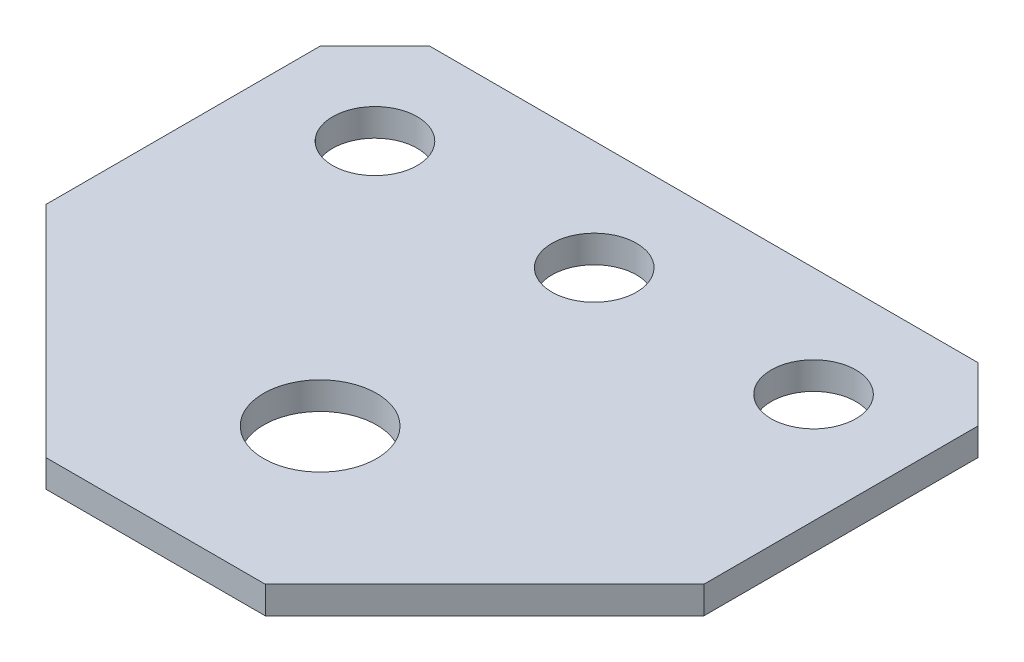
ISO-10303-21;
HEADER;
FILE_DESCRIPTION(('STEP AP214'),'2;1');
FILE_NAME('part.step','',(''),(''),'','','');
FILE_SCHEMA(('AUTOMOTIVE_DESIGN { 1 0 10303 214 1 1 1 1 }'));
ENDSEC;
DATA;
#1=APPLICATION_CONTEXT('core data for automotive mechanical design processes');
#2=APPLICATION_PROTOCOL_DEFINITION('international standard','automotive_design',2000,#1);
#3=PRODUCT_CONTEXT('',#1,'mechanical');
#4=PRODUCT('Part','Part','',(#3));
#5=PRODUCT_RELATED_PRODUCT_CATEGORY('part','',(#4));
#6=PRODUCT_DEFINITION_FORMATION('','',#4);
#7=PRODUCT_DEFINITION_CONTEXT('part definition',#1,'design');
#8=PRODUCT_DEFINITION('design','',#6,#7);
#9=PRODUCT_DEFINITION_SHAPE('','',#8);
#10=(LENGTH_UNIT() NAMED_UNIT(*) SI_UNIT(.MILLI.,.METRE.));
#11=(NAMED_UNIT(*) PLANE_ANGLE_UNIT() SI_UNIT($,.RADIAN.));
#12=(NAMED_UNIT(*) SI_UNIT($,.STERADIAN.) SOLID_ANGLE_UNIT());
#13=UNCERTAINTY_MEASURE_WITH_UNIT(LENGTH_MEASURE(1.E-05),#10,'distance_accuracy_value','');
#14=(GEOMETRIC_REPRESENTATION_CONTEXT(3) GLOBAL_UNCERTAINTY_ASSIGNED_CONTEXT((#13)) GLOBAL_UNIT_ASSIGNED_CONTEXT((#10,
#11,#12)) REPRESENTATION_CONTEXT('',''));
#15=CARTESIAN_POINT('',(0.,0.,0.));
#16=DIRECTION('',(0.,0.,1.));
#17=DIRECTION('',(1.,0.,0.));
#18=AXIS2_PLACEMENT_3D('',#15,#16,#17);
#19=CARTESIAN_POINT('',(38.1,1.5875,-31.75));
#20=DIRECTION('',(-1.,0.,0.));
#21=DIRECTION('',(0.,0.,1.));
#22=AXIS2_PLACEMENT_3D('',#19,#20,#21);
#23=PLANE('',#22);
#24=DIRECTION('',(0.,0.,-1.));
#25=VECTOR('',#24,1.);
#26=CARTESIAN_POINT('',(38.1,-1.5875,-31.75));
#27=LINE('',#26,#25);
#28=CARTESIAN_POINT('',(38.1,-1.5875,6.35000000000001));
#29=VERTEX_POINT('',#28);
#30=CARTESIAN_POINT('',(38.1,-1.5875,-25.4));
#31=VERTEX_POINT('',#30);
#32=EDGE_CURVE('E170',#29,#31,#27,.T.);
#33=ORIENTED_EDGE('',*,*,#32,.T.);
#34=DIRECTION('',(0.,1.,0.));
#35=VECTOR('',#34,1.);
#36=CARTESIAN_POINT('',(38.1,1.5875,-25.4));
#37=LINE('',#36,#35);
#38=CARTESIAN_POINT('',(38.1,1.5875,-25.4));
#39=VERTEX_POINT('',#38);
#40=EDGE_CURVE('E11',#31,#39,#37,.T.);
#41=ORIENTED_EDGE('',*,*,#40,.T.);
#42=DIRECTION('',(0.,0.,-1.));
#43=VECTOR('',#42,1.);
#44=CARTESIAN_POINT('',(38.1,1.5875,-31.75));
#45=LINE('',#44,#43);
#46=CARTESIAN_POINT('',(38.1,1.5875,6.35000000000001));
#47=VERTEX_POINT('',#46);
#48=EDGE_CURVE('E125',#47,#39,#45,.T.);
#49=ORIENTED_EDGE('',*,*,#48,.F.);
#50=DIRECTION('',(0.,-1.,0.));
#51=VECTOR('',#50,1.);
#52=CARTESIAN_POINT('',(38.1,1.5875,6.35000000000001));
#53=LINE('',#52,#51);
#54=EDGE_CURVE('E141',#47,#29,#53,.T.);
#55=ORIENTED_EDGE('',*,*,#54,.T.);
#56=EDGE_LOOP('',(#33,#41,#49,#55));
#57=FACE_BOUND('',#56,.T.);
#58=ADVANCED_FACE('F33',(#57),#23,.F.);
#59=CARTESIAN_POINT('',(-38.1,1.5875,-31.75));
#60=DIRECTION('',(0.,0.,1.));
#61=DIRECTION('',(1.,0.,0.));
#62=AXIS2_PLACEMENT_3D('',#59,#60,#61);
#63=PLANE('',#62);
#64=DIRECTION('',(-1.,0.,0.));
#65=VECTOR('',#64,1.);
#66=CARTESIAN_POINT('',(-38.1,-1.5875,-31.75));
#67=LINE('',#66,#65);
#68=CARTESIAN_POINT('',(31.75,-1.5875,-31.75));
#69=VERTEX_POINT('',#68);
#70=CARTESIAN_POINT('',(-31.75,-1.5875,-31.75));
#71=VERTEX_POINT('',#70);
#72=EDGE_CURVE('E130',#69,#71,#67,.T.);
#73=ORIENTED_EDGE('',*,*,#72,.T.);
#74=DIRECTION('',(0.,1.,0.));
#75=VECTOR('',#74,1.);
#76=CARTESIAN_POINT('',(-31.75,1.5875,-31.75));
#77=LINE('',#76,#75);
#78=CARTESIAN_POINT('',(-31.75,1.5875,-31.75));
#79=VERTEX_POINT('',#78);
#80=EDGE_CURVE('E54',#71,#79,#77,.T.);
#81=ORIENTED_EDGE('',*,*,#80,.T.);
#82=DIRECTION('',(-1.,0.,0.));
#83=VECTOR('',#82,1.);
#84=CARTESIAN_POINT('',(-38.1,1.5875,-31.75));
#85=LINE('',#84,#83);
#86=CARTESIAN_POINT('',(31.75,1.5875,-31.75));
#87=VERTEX_POINT('',#86);
#88=EDGE_CURVE('E128',#87,#79,#85,.T.);
#89=ORIENTED_EDGE('',*,*,#88,.F.);
#90=DIRECTION('',(0.,-1.,0.));
#91=VECTOR('',#90,1.);
#92=CARTESIAN_POINT('',(31.75,1.5875,-31.75));
#93=LINE('',#92,#91);
#94=EDGE_CURVE('E151',#87,#69,#93,.T.);
#95=ORIENTED_EDGE('',*,*,#94,.T.);
#96=EDGE_LOOP('',(#73,#81,#89,#95));
#97=FACE_BOUND('',#96,.T.);
#98=ADVANCED_FACE('F168',(#97),#63,.F.);
#99=CARTESIAN_POINT('',(-38.1,1.5875,-31.75));
#100=DIRECTION('',(1.,0.,0.));
#101=DIRECTION('',(0.,0.,-1.));
#102=AXIS2_PLACEMENT_3D('',#99,#100,#101);
#103=PLANE('',#102);
#104=DIRECTION('',(0.,0.,1.));
#105=VECTOR('',#104,1.);
#106=CARTESIAN_POINT('',(-38.1,1.5875,-31.75));
#107=LINE('',#106,#105);
#108=CARTESIAN_POINT('',(-38.1,1.5875,-25.4));
#109=VERTEX_POINT('',#108);
#110=CARTESIAN_POINT('',(-38.1,1.5875,6.34999999999989));
#111=VERTEX_POINT('',#110);
#112=EDGE_CURVE('E160',#109,#111,#107,.T.);
#113=ORIENTED_EDGE('',*,*,#112,.F.);
#114=DIRECTION('',(0.,-1.,0.));
#115=VECTOR('',#114,1.);
#116=CARTESIAN_POINT('',(-38.1,1.5875,-25.4));
#117=LINE('',#116,#115);
#118=CARTESIAN_POINT('',(-38.1,-1.5875,-25.4));
#119=VERTEX_POINT('',#118);
#120=EDGE_CURVE('E144',#109,#119,#117,.T.);
#121=ORIENTED_EDGE('',*,*,#120,.T.);
#122=DIRECTION('',(0.,0.,1.));
#123=VECTOR('',#122,1.);
#124=CARTESIAN_POINT('',(-38.1,-1.5875,-31.75));
#125=LINE('',#124,#123);
#126=CARTESIAN_POINT('',(-38.1,-1.5875,6.34999999999989));
#127=VERTEX_POINT('',#126);
#128=EDGE_CURVE('E126',#119,#127,#125,.T.);
#129=ORIENTED_EDGE('',*,*,#128,.T.);
#130=DIRECTION('',(0.,1.,0.));
#131=VECTOR('',#130,1.);
#132=CARTESIAN_POINT('',(-38.1,1.5875,6.34999999999989));
#133=LINE('',#132,#131);
#134=EDGE_CURVE('E107',#127,#111,#133,.T.);
#135=ORIENTED_EDGE('',*,*,#134,.T.);
#136=EDGE_LOOP('',(#113,#121,#129,#135));
#137=FACE_BOUND('',#136,.T.);
#138=ADVANCED_FACE('F164',(#137),#103,.F.);
#139=CARTESIAN_POINT('',(-38.1,1.5875,31.75));
#140=DIRECTION('',(0.,0.,-1.));
#141=DIRECTION('',(-1.,0.,0.));
#142=AXIS2_PLACEMENT_3D('',#139,#140,#141);
#143=PLANE('',#142);
#144=DIRECTION('',(1.,0.,0.));
#145=VECTOR('',#144,1.);
#146=CARTESIAN_POINT('',(-38.1,1.5875,31.75));
#147=LINE('',#146,#145);
#148=CARTESIAN_POINT('',(-12.7,1.5875,31.75));
#149=VERTEX_POINT('',#148);
#150=CARTESIAN_POINT('',(12.6999999999999,1.5875,31.75));
#151=VERTEX_POINT('',#150);
#152=EDGE_CURVE('E120',#149,#151,#147,.T.);
#153=ORIENTED_EDGE('',*,*,#152,.F.);
#154=DIRECTION('',(0.,-1.,0.));
#155=VECTOR('',#154,1.);
#156=CARTESIAN_POINT('',(-12.7,1.5875,31.75));
#157=LINE('',#156,#155);
#158=CARTESIAN_POINT('',(-12.7,-1.5875,31.75));
#159=VERTEX_POINT('',#158);
#160=EDGE_CURVE('E105',#149,#159,#157,.T.);
#161=ORIENTED_EDGE('',*,*,#160,.T.);
#162=DIRECTION('',(1.,0.,0.));
#163=VECTOR('',#162,1.);
#164=CARTESIAN_POINT('',(-38.1,-1.5875,31.75));
#165=LINE('',#164,#163);
#166=CARTESIAN_POINT('',(12.6999999999999,-1.5875,31.75));
#167=VERTEX_POINT('',#166);
#168=EDGE_CURVE('E117',#159,#167,#165,.T.);
#169=ORIENTED_EDGE('',*,*,#168,.T.);
#170=DIRECTION('',(0.,1.,0.));
#171=VECTOR('',#170,1.);
#172=CARTESIAN_POINT('',(12.6999999999999,1.5875,31.75));
#173=LINE('',#172,#171);
#174=EDGE_CURVE('E121',#167,#151,#173,.T.);
#175=ORIENTED_EDGE('',*,*,#174,.T.);
#176=EDGE_LOOP('',(#153,#161,#169,#175));
#177=FACE_BOUND('',#176,.T.);
#178=ADVANCED_FACE('F116',(#177),#143,.F.);
#179=CARTESIAN_POINT('',(0.,1.5875,0.));
#180=DIRECTION('',(0.,1.,0.));
#181=DIRECTION('',(0.,0.,1.));
#182=AXIS2_PLACEMENT_3D('',#179,#180,#181);
#183=PLANE('',#182);
#184=CARTESIAN_POINT('',(0.,1.5875,12.7));
#185=DIRECTION('',(0.,1.,0.));
#186=DIRECTION('',(0.,0.,1.));
#187=AXIS2_PLACEMENT_3D('',#184,#185,#186);
#188=CIRCLE('',#187,6.54811999999995);
#189=CARTESIAN_POINT('',(0.,1.5875,19.24812));
#190=VERTEX_POINT('',#189);
#191=EDGE_CURVE('E196',#190,#190,#188,.T.);
#192=ORIENTED_EDGE('',*,*,#191,.F.);
#193=EDGE_LOOP('',(#192));
#194=FACE_BOUND('',#193,.T.);
#195=CARTESIAN_POINT('',(0.,1.5875,-19.05));
#196=DIRECTION('',(0.,1.,0.));
#197=DIRECTION('',(0.,0.,1.));
#198=AXIS2_PLACEMENT_3D('',#195,#196,#197);
#199=CIRCLE('',#198,4.9022);
#200=CARTESIAN_POINT('',(0.,1.5875,-14.1478));
#201=VERTEX_POINT('',#200);
#202=EDGE_CURVE('E190',#201,#201,#199,.T.);
#203=ORIENTED_EDGE('',*,*,#202,.F.);
#204=EDGE_LOOP('',(#203));
#205=FACE_BOUND('',#204,.T.);
#206=CARTESIAN_POINT('',(25.4,1.5875,-19.05));
#207=DIRECTION('',(0.,1.,0.));
#208=DIRECTION('',(0.,0.,1.));
#209=AXIS2_PLACEMENT_3D('',#206,#207,#208);
#210=CIRCLE('',#209,4.9022);
#211=CARTESIAN_POINT('',(25.4,1.5875,-14.1478));
#212=VERTEX_POINT('',#211);
#213=EDGE_CURVE('E184',#212,#212,#210,.T.);
#214=ORIENTED_EDGE('',*,*,#213,.F.);
#215=EDGE_LOOP('',(#214));
#216=FACE_BOUND('',#215,.T.);
#217=CARTESIAN_POINT('',(-25.4,1.5875,-19.05));
#218=DIRECTION('',(0.,1.,0.));
#219=DIRECTION('',(0.,0.,1.));
#220=AXIS2_PLACEMENT_3D('',#217,#218,#219);
#221=CIRCLE('',#220,4.9022);
#222=CARTESIAN_POINT('',(-25.4,1.5875,-14.1478));
#223=VERTEX_POINT('',#222);
#224=EDGE_CURVE('E178',#223,#223,#221,.T.);
#225=ORIENTED_EDGE('',*,*,#224,.F.);
#226=EDGE_LOOP('',(#225));
#227=FACE_BOUND('',#226,.T.);
#228=ORIENTED_EDGE('',*,*,#88,.T.);
#229=DIRECTION('',(0.707106781186548,0.,-0.707106781186547));
#230=VECTOR('',#229,1.);
#231=CARTESIAN_POINT('',(-31.7499999999999,1.5875,-31.75));
#232=LINE('',#231,#230);
#233=EDGE_CURVE('E41',#79,#109,#232,.F.);
#234=ORIENTED_EDGE('',*,*,#233,.T.);
#235=ORIENTED_EDGE('',*,*,#112,.T.);
#236=DIRECTION('',(-0.707106781186546,0.,-0.707106781186549));
#237=VECTOR('',#236,1.);
#238=CARTESIAN_POINT('',(-22.225,1.5875,22.2249999999999));
#239=LINE('',#238,#237);
#240=EDGE_CURVE('E139',#111,#149,#239,.F.);
#241=ORIENTED_EDGE('',*,*,#240,.T.);
#242=ORIENTED_EDGE('',*,*,#152,.T.);
#243=DIRECTION('',(-0.707106781186549,0.,0.707106781186546));
#244=VECTOR('',#243,1.);
#245=CARTESIAN_POINT('',(22.2249999999999,1.5875,22.225));
#246=LINE('',#245,#244);
#247=EDGE_CURVE('E137',#151,#47,#246,.F.);
#248=ORIENTED_EDGE('',*,*,#247,.T.);
#249=ORIENTED_EDGE('',*,*,#48,.T.);
#250=DIRECTION('',(0.707106781186547,0.,0.707106781186548));
#251=VECTOR('',#250,1.);
#252=CARTESIAN_POINT('',(31.75,1.5875,-31.75));
#253=LINE('',#252,#251);
#254=EDGE_CURVE('E155',#39,#87,#253,.F.);
#255=ORIENTED_EDGE('',*,*,#254,.T.);
#256=EDGE_LOOP('',(#228,#234,#235,#241,#242,#248,#249,#255));
#257=FACE_BOUND('',#256,.T.);
#258=ADVANCED_FACE('F159',(#194,#205,#216,#227,#257),#183,.T.);
#259=CARTESIAN_POINT('',(0.,-1.5875,0.));
#260=DIRECTION('',(0.,1.,0.));
#261=DIRECTION('',(0.,0.,1.));
#262=AXIS2_PLACEMENT_3D('',#259,#260,#261);
#263=PLANE('',#262);
#264=CARTESIAN_POINT('',(0.,-1.58749999999998,12.7));
#265=DIRECTION('',(0.,1.,0.));
#266=DIRECTION('',(0.,0.,1.));
#267=AXIS2_PLACEMENT_3D('',#264,#265,#266);
#268=CIRCLE('',#267,6.54811999999995);
#269=CARTESIAN_POINT('',(0.,-1.58749999999998,19.24812));
#270=VERTEX_POINT('',#269);
#271=EDGE_CURVE('E193',#270,#270,#268,.T.);
#272=ORIENTED_EDGE('',*,*,#271,.T.);
#273=EDGE_LOOP('',(#272));
#274=FACE_BOUND('',#273,.T.);
#275=CARTESIAN_POINT('',(0.,-1.5875,-19.05));
#276=DIRECTION('',(0.,1.,0.));
#277=DIRECTION('',(0.,0.,1.));
#278=AXIS2_PLACEMENT_3D('',#275,#276,#277);
#279=CIRCLE('',#278,4.9022);
#280=CARTESIAN_POINT('',(0.,-1.5875,-14.1478));
#281=VERTEX_POINT('',#280);
#282=EDGE_CURVE('E187',#281,#281,#279,.T.);
#283=ORIENTED_EDGE('',*,*,#282,.T.);
#284=EDGE_LOOP('',(#283));
#285=FACE_BOUND('',#284,.T.);
#286=CARTESIAN_POINT('',(25.4,-1.5875,-19.05));
#287=DIRECTION('',(0.,1.,0.));
#288=DIRECTION('',(0.,0.,1.));
#289=AXIS2_PLACEMENT_3D('',#286,#287,#288);
#290=CIRCLE('',#289,4.9022);
#291=CARTESIAN_POINT('',(25.4,-1.5875,-14.1478));
#292=VERTEX_POINT('',#291);
#293=EDGE_CURVE('E181',#292,#292,#290,.T.);
#294=ORIENTED_EDGE('',*,*,#293,.T.);
#295=EDGE_LOOP('',(#294));
#296=FACE_BOUND('',#295,.T.);
#297=CARTESIAN_POINT('',(-25.4,-1.5875,-19.05));
#298=DIRECTION('',(0.,1.,0.));
#299=DIRECTION('',(0.,0.,1.));
#300=AXIS2_PLACEMENT_3D('',#297,#298,#299);
#301=CIRCLE('',#300,4.9022);
#302=CARTESIAN_POINT('',(-25.4,-1.5875,-14.1478));
#303=VERTEX_POINT('',#302);
#304=EDGE_CURVE('E171',#303,#303,#301,.T.);
#305=ORIENTED_EDGE('',*,*,#304,.T.);
#306=EDGE_LOOP('',(#305));
#307=FACE_BOUND('',#306,.T.);
#308=ORIENTED_EDGE('',*,*,#128,.F.);
#309=DIRECTION('',(-0.707106781186548,0.,0.707106781186547));
#310=VECTOR('',#309,1.);
#311=CARTESIAN_POINT('',(-38.1,-1.5875,-25.4));
#312=LINE('',#311,#310);
#313=EDGE_CURVE('E149',#119,#71,#312,.F.);
#314=ORIENTED_EDGE('',*,*,#313,.T.);
#315=ORIENTED_EDGE('',*,*,#72,.F.);
#316=DIRECTION('',(-0.707106781186547,0.,-0.707106781186548));
#317=VECTOR('',#316,1.);
#318=CARTESIAN_POINT('',(31.75,-1.5875,-31.75));
#319=LINE('',#318,#317);
#320=EDGE_CURVE('E147',#69,#31,#319,.F.);
#321=ORIENTED_EDGE('',*,*,#320,.T.);
#322=ORIENTED_EDGE('',*,*,#32,.F.);
#323=DIRECTION('',(0.707106781186549,0.,-0.707106781186546));
#324=VECTOR('',#323,1.);
#325=CARTESIAN_POINT('',(38.1,-1.5875,6.35000000000001));
#326=LINE('',#325,#324);
#327=EDGE_CURVE('E111',#29,#167,#326,.F.);
#328=ORIENTED_EDGE('',*,*,#327,.T.);
#329=ORIENTED_EDGE('',*,*,#168,.F.);
#330=DIRECTION('',(0.707106781186546,0.,0.707106781186549));
#331=VECTOR('',#330,1.);
#332=CARTESIAN_POINT('',(-12.7,-1.5875,31.75));
#333=LINE('',#332,#331);
#334=EDGE_CURVE('E101',#159,#127,#333,.F.);
#335=ORIENTED_EDGE('',*,*,#334,.T.);
#336=EDGE_LOOP('',(#308,#314,#315,#321,#322,#328,#329,#335));
#337=FACE_BOUND('',#336,.T.);
#338=ADVANCED_FACE('F123',(#274,#285,#296,#307,#337),#263,.F.);
#339=CARTESIAN_POINT('',(-25.4,1.5875,-19.05));
#340=DIRECTION('',(0.,1.,0.));
#341=DIRECTION('',(0.,0.,1.));
#342=AXIS2_PLACEMENT_3D('',#339,#340,#341);
#343=CYLINDRICAL_SURFACE('',#342,4.9022);
#344=ORIENTED_EDGE('',*,*,#304,.F.);
#345=EDGE_LOOP('',(#344));
#346=FACE_BOUND('',#345,.T.);
#347=ORIENTED_EDGE('',*,*,#224,.T.);
#348=EDGE_LOOP('',(#347));
#349=FACE_BOUND('',#348,.T.);
#350=ADVANCED_FACE('F211',(#346,#349),#343,.F.);
#351=CARTESIAN_POINT('',(25.4,1.5875,-19.05));
#352=DIRECTION('',(0.,1.,0.));
#353=DIRECTION('',(0.,0.,1.));
#354=AXIS2_PLACEMENT_3D('',#351,#352,#353);
#355=CYLINDRICAL_SURFACE('',#354,4.9022);
#356=ORIENTED_EDGE('',*,*,#293,.F.);
#357=EDGE_LOOP('',(#356));
#358=FACE_BOUND('',#357,.T.);
#359=ORIENTED_EDGE('',*,*,#213,.T.);
#360=EDGE_LOOP('',(#359));
#361=FACE_BOUND('',#360,.T.);
#362=ADVANCED_FACE('F213',(#358,#361),#355,.F.);
#363=CARTESIAN_POINT('',(0.,1.5875,-19.05));
#364=DIRECTION('',(0.,1.,0.));
#365=DIRECTION('',(0.,0.,1.));
#366=AXIS2_PLACEMENT_3D('',#363,#364,#365);
#367=CYLINDRICAL_SURFACE('',#366,4.9022);
#368=ORIENTED_EDGE('',*,*,#282,.F.);
#369=EDGE_LOOP('',(#368));
#370=FACE_BOUND('',#369,.T.);
#371=ORIENTED_EDGE('',*,*,#202,.T.);
#372=EDGE_LOOP('',(#371));
#373=FACE_BOUND('',#372,.T.);
#374=ADVANCED_FACE('F220',(#370,#373),#367,.F.);
#375=CARTESIAN_POINT('',(0.,1.5875,12.7));
#376=DIRECTION('',(0.,1.,0.));
#377=DIRECTION('',(0.,0.,1.));
#378=AXIS2_PLACEMENT_3D('',#375,#376,#377);
#379=CYLINDRICAL_SURFACE('',#378,6.54811999999995);
#380=ORIENTED_EDGE('',*,*,#271,.F.);
#381=EDGE_LOOP('',(#380));
#382=FACE_BOUND('',#381,.T.);
#383=ORIENTED_EDGE('',*,*,#191,.T.);
#384=EDGE_LOOP('',(#383));
#385=FACE_BOUND('',#384,.T.);
#386=ADVANCED_FACE('F200',(#382,#385),#379,.F.);
#387=CARTESIAN_POINT('',(-12.7,1.5875,31.75));
#388=DIRECTION('',(0.707106781186549,0.,-0.707106781186546));
#389=DIRECTION('',(0.,-1.,0.));
#390=AXIS2_PLACEMENT_3D('',#387,#388,#389);
#391=PLANE('',#390);
#392=ORIENTED_EDGE('',*,*,#240,.F.);
#393=ORIENTED_EDGE('',*,*,#134,.F.);
#394=ORIENTED_EDGE('',*,*,#334,.F.);
#395=ORIENTED_EDGE('',*,*,#160,.F.);
#396=EDGE_LOOP('',(#392,#393,#394,#395));
#397=FACE_BOUND('',#396,.T.);
#398=ADVANCED_FACE('F104',(#397),#391,.F.);
#399=CARTESIAN_POINT('',(38.1,1.5875,6.35000000000001));
#400=DIRECTION('',(-0.707106781186546,0.,-0.707106781186549));
#401=DIRECTION('',(0.,-1.,0.));
#402=AXIS2_PLACEMENT_3D('',#399,#400,#401);
#403=PLANE('',#402);
#404=ORIENTED_EDGE('',*,*,#247,.F.);
#405=ORIENTED_EDGE('',*,*,#174,.F.);
#406=ORIENTED_EDGE('',*,*,#327,.F.);
#407=ORIENTED_EDGE('',*,*,#54,.F.);
#408=EDGE_LOOP('',(#404,#405,#406,#407));
#409=FACE_BOUND('',#408,.T.);
#410=ADVANCED_FACE('F236',(#409),#403,.F.);
#411=CARTESIAN_POINT('',(-38.1,1.5875,-25.4));
#412=DIRECTION('',(0.707106781186547,0.,0.707106781186548));
#413=DIRECTION('',(0.,-1.,0.));
#414=AXIS2_PLACEMENT_3D('',#411,#412,#413);
#415=PLANE('',#414);
#416=ORIENTED_EDGE('',*,*,#233,.F.);
#417=ORIENTED_EDGE('',*,*,#80,.F.);
#418=ORIENTED_EDGE('',*,*,#313,.F.);
#419=ORIENTED_EDGE('',*,*,#120,.F.);
#420=EDGE_LOOP('',(#416,#417,#418,#419));
#421=FACE_BOUND('',#420,.T.);
#422=ADVANCED_FACE('F166',(#421),#415,.F.);
#423=CARTESIAN_POINT('',(31.75,1.5875,-31.75));
#424=DIRECTION('',(-0.707106781186548,0.,0.707106781186547));
#425=DIRECTION('',(0.,-1.,0.));
#426=AXIS2_PLACEMENT_3D('',#423,#424,#425);
#427=PLANE('',#426);
#428=ORIENTED_EDGE('',*,*,#254,.F.);
#429=ORIENTED_EDGE('',*,*,#40,.F.);
#430=ORIENTED_EDGE('',*,*,#320,.F.);
#431=ORIENTED_EDGE('',*,*,#94,.F.);
#432=EDGE_LOOP('',(#428,#429,#430,#431));
#433=FACE_BOUND('',#432,.T.);
#434=ADVANCED_FACE('F35',(#433),#427,.F.);
#435=CLOSED_SHELL('',(#58,#98,#138,#178,#258,#338,#350,#362,#374,#386,#398,#410,#422,#434));
#436=MANIFOLD_SOLID_BREP('B2',#435);
#437=ADVANCED_BREP_SHAPE_REPRESENTATION('',(#18,#436),#14);
#438=SHAPE_DEFINITION_REPRESENTATION(#9,#437);
ENDSEC;
END-ISO-10303-21;
